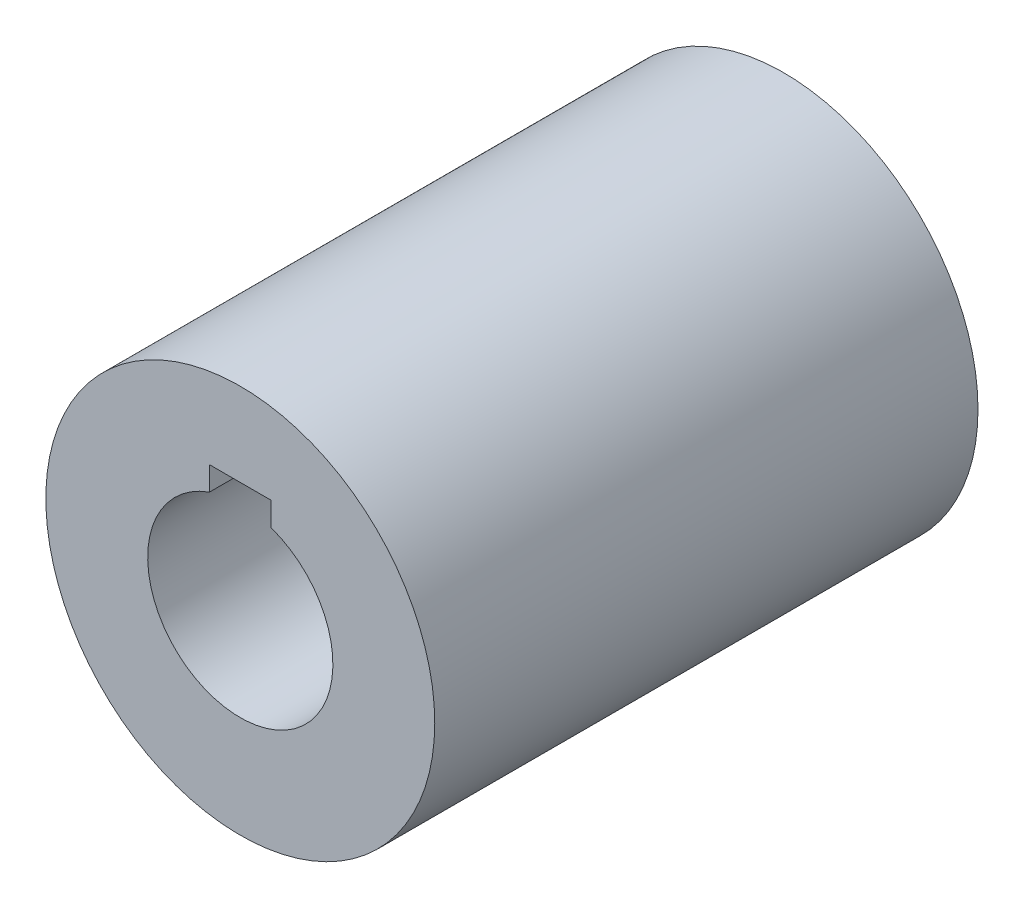
ISO-10303-21;
HEADER;
FILE_DESCRIPTION(('STEP AP214'),'2;1');
FILE_NAME('part.step','',(''),(''),'','','');
FILE_SCHEMA(('AUTOMOTIVE_DESIGN { 1 0 10303 214 1 1 1 1 }'));
ENDSEC;
DATA;
#1=APPLICATION_CONTEXT('core data for automotive mechanical design processes');
#2=APPLICATION_PROTOCOL_DEFINITION('international standard','automotive_design',2000,#1);
#3=PRODUCT_CONTEXT('',#1,'mechanical');
#4=PRODUCT('Part','Part','',(#3));
#5=PRODUCT_RELATED_PRODUCT_CATEGORY('part','',(#4));
#6=PRODUCT_DEFINITION_FORMATION('','',#4);
#7=PRODUCT_DEFINITION_CONTEXT('part definition',#1,'design');
#8=PRODUCT_DEFINITION('design','',#6,#7);
#9=PRODUCT_DEFINITION_SHAPE('','',#8);
#10=(LENGTH_UNIT() NAMED_UNIT(*) SI_UNIT(.MILLI.,.METRE.));
#11=(NAMED_UNIT(*) PLANE_ANGLE_UNIT() SI_UNIT($,.RADIAN.));
#12=(NAMED_UNIT(*) SI_UNIT($,.STERADIAN.) SOLID_ANGLE_UNIT());
#13=UNCERTAINTY_MEASURE_WITH_UNIT(LENGTH_MEASURE(1.E-05),#10,'distance_accuracy_value','');
#14=(GEOMETRIC_REPRESENTATION_CONTEXT(3) GLOBAL_UNCERTAINTY_ASSIGNED_CONTEXT((#13)) GLOBAL_UNIT_ASSIGNED_CONTEXT((#10,
#11,#12)) REPRESENTATION_CONTEXT('',''));
#15=CARTESIAN_POINT('',(0.,0.,0.));
#16=DIRECTION('',(0.,0.,1.));
#17=DIRECTION('',(1.,0.,0.));
#18=AXIS2_PLACEMENT_3D('',#15,#16,#17);
#19=CARTESIAN_POINT('',(0.,0.,88.));
#20=DIRECTION('',(0.,0.,1.));
#21=DIRECTION('',(1.,0.,0.));
#22=AXIS2_PLACEMENT_3D('',#19,#20,#21);
#23=PLANE('',#22);
#24=CARTESIAN_POINT('',(0.,0.,88.));
#25=DIRECTION('',(0.,0.,1.));
#26=DIRECTION('',(1.,0.,0.));
#27=AXIS2_PLACEMENT_3D('',#24,#25,#26);
#28=CIRCLE('',#27,31.5);
#29=CARTESIAN_POINT('',(31.5,0.,88.));
#30=VERTEX_POINT('',#29);
#31=EDGE_CURVE('E11',#30,#30,#28,.T.);
#32=ORIENTED_EDGE('',*,*,#31,.T.);
#33=EDGE_LOOP('',(#32));
#34=FACE_BOUND('',#33,.T.);
#35=DIRECTION('',(0.,1.,0.));
#36=VECTOR('',#35,1.);
#37=CARTESIAN_POINT('',(5.,18.,88.));
#38=LINE('',#37,#36);
#39=CARTESIAN_POINT('',(4.99999999999999,14.142135623731,88.));
#40=VERTEX_POINT('',#39);
#41=CARTESIAN_POINT('',(5.,18.,88.));
#42=VERTEX_POINT('',#41);
#43=EDGE_CURVE('E90',#40,#42,#38,.T.);
#44=ORIENTED_EDGE('',*,*,#43,.F.);
#45=CARTESIAN_POINT('',(0.,0.,88.));
#46=DIRECTION('',(0.,0.,1.));
#47=DIRECTION('',(1.,0.,0.));
#48=AXIS2_PLACEMENT_3D('',#45,#46,#47);
#49=CIRCLE('',#48,15.);
#50=CARTESIAN_POINT('',(-5.,14.142135623731,88.));
#51=VERTEX_POINT('',#50);
#52=EDGE_CURVE('E82',#51,#40,#49,.T.);
#53=ORIENTED_EDGE('',*,*,#52,.F.);
#54=DIRECTION('',(0.,-1.,0.));
#55=VECTOR('',#54,1.);
#56=CARTESIAN_POINT('',(-5.,18.,88.));
#57=LINE('',#56,#55);
#58=CARTESIAN_POINT('',(-5.,18.,88.));
#59=VERTEX_POINT('',#58);
#60=EDGE_CURVE('E103',#59,#51,#57,.T.);
#61=ORIENTED_EDGE('',*,*,#60,.F.);
#62=DIRECTION('',(-1.,0.,0.));
#63=VECTOR('',#62,1.);
#64=CARTESIAN_POINT('',(-5.,18.,88.));
#65=LINE('',#64,#63);
#66=EDGE_CURVE('E101',#42,#59,#65,.T.);
#67=ORIENTED_EDGE('',*,*,#66,.F.);
#68=EDGE_LOOP('',(#44,#53,#61,#67));
#69=FACE_BOUND('',#68,.T.);
#70=ADVANCED_FACE('F41',(#34,#69),#23,.T.);
#71=CARTESIAN_POINT('',(0.,0.,0.));
#72=DIRECTION('',(0.,0.,1.));
#73=DIRECTION('',(1.,0.,0.));
#74=AXIS2_PLACEMENT_3D('',#71,#72,#73);
#75=PLANE('',#74);
#76=CARTESIAN_POINT('',(0.,0.,0.));
#77=DIRECTION('',(0.,0.,1.));
#78=DIRECTION('',(1.,0.,0.));
#79=AXIS2_PLACEMENT_3D('',#76,#77,#78);
#80=CIRCLE('',#79,31.5);
#81=CARTESIAN_POINT('',(31.5,0.,0.));
#82=VERTEX_POINT('',#81);
#83=EDGE_CURVE('E45',#82,#82,#80,.T.);
#84=ORIENTED_EDGE('',*,*,#83,.F.);
#85=EDGE_LOOP('',(#84));
#86=FACE_BOUND('',#85,.T.);
#87=CARTESIAN_POINT('',(0.,0.,0.));
#88=DIRECTION('',(0.,0.,1.));
#89=DIRECTION('',(1.,0.,0.));
#90=AXIS2_PLACEMENT_3D('',#87,#88,#89);
#91=CIRCLE('',#90,15.);
#92=CARTESIAN_POINT('',(-5.,14.142135623731,0.));
#93=VERTEX_POINT('',#92);
#94=CARTESIAN_POINT('',(4.99999999999999,14.142135623731,0.));
#95=VERTEX_POINT('',#94);
#96=EDGE_CURVE('E64',#93,#95,#91,.T.);
#97=ORIENTED_EDGE('',*,*,#96,.T.);
#98=DIRECTION('',(0.,1.,0.));
#99=VECTOR('',#98,1.);
#100=CARTESIAN_POINT('',(5.,18.,0.));
#101=LINE('',#100,#99);
#102=CARTESIAN_POINT('',(5.,18.,0.));
#103=VERTEX_POINT('',#102);
#104=EDGE_CURVE('E97',#95,#103,#101,.T.);
#105=ORIENTED_EDGE('',*,*,#104,.T.);
#106=DIRECTION('',(-1.,0.,0.));
#107=VECTOR('',#106,1.);
#108=CARTESIAN_POINT('',(-5.,18.,0.));
#109=LINE('',#108,#107);
#110=CARTESIAN_POINT('',(-5.,18.,0.));
#111=VERTEX_POINT('',#110);
#112=EDGE_CURVE('E109',#103,#111,#109,.T.);
#113=ORIENTED_EDGE('',*,*,#112,.T.);
#114=DIRECTION('',(0.,-1.,0.));
#115=VECTOR('',#114,1.);
#116=CARTESIAN_POINT('',(-5.,18.,0.));
#117=LINE('',#116,#115);
#118=EDGE_CURVE('E91',#111,#93,#117,.T.);
#119=ORIENTED_EDGE('',*,*,#118,.T.);
#120=EDGE_LOOP('',(#97,#105,#113,#119));
#121=FACE_BOUND('',#120,.T.);
#122=ADVANCED_FACE('F120',(#86,#121),#75,.F.);
#123=CARTESIAN_POINT('',(0.,0.,88.));
#124=DIRECTION('',(0.,0.,-1.));
#125=DIRECTION('',(-1.,0.,0.));
#126=AXIS2_PLACEMENT_3D('',#123,#124,#125);
#127=CYLINDRICAL_SURFACE('',#126,31.5);
#128=ORIENTED_EDGE('',*,*,#31,.F.);
#129=EDGE_LOOP('',(#128));
#130=FACE_BOUND('',#129,.T.);
#131=ORIENTED_EDGE('',*,*,#83,.T.);
#132=EDGE_LOOP('',(#131));
#133=FACE_BOUND('',#132,.T.);
#134=ADVANCED_FACE('F43',(#130,#133),#127,.T.);
#135=CARTESIAN_POINT('',(0.,0.,88.));
#136=DIRECTION('',(0.,0.,-1.));
#137=DIRECTION('',(-1.,0.,0.));
#138=AXIS2_PLACEMENT_3D('',#135,#136,#137);
#139=CYLINDRICAL_SURFACE('',#138,15.);
#140=ORIENTED_EDGE('',*,*,#96,.F.);
#141=DIRECTION('',(0.,0.,-1.));
#142=VECTOR('',#141,1.);
#143=CARTESIAN_POINT('',(-5.,14.142135623731,88.));
#144=LINE('',#143,#142);
#145=EDGE_CURVE('E86',#51,#93,#144,.T.);
#146=ORIENTED_EDGE('',*,*,#145,.F.);
#147=ORIENTED_EDGE('',*,*,#52,.T.);
#148=DIRECTION('',(0.,0.,-1.));
#149=VECTOR('',#148,1.);
#150=CARTESIAN_POINT('',(4.99999999999999,14.142135623731,88.));
#151=LINE('',#150,#149);
#152=EDGE_CURVE('E85',#40,#95,#151,.T.);
#153=ORIENTED_EDGE('',*,*,#152,.T.);
#154=EDGE_LOOP('',(#140,#146,#147,#153));
#155=FACE_BOUND('',#154,.T.);
#156=ADVANCED_FACE('F84',(#155),#139,.F.);
#157=CARTESIAN_POINT('',(5.,18.,88.));
#158=DIRECTION('',(-1.,0.,0.));
#159=DIRECTION('',(0.,-1.,0.));
#160=AXIS2_PLACEMENT_3D('',#157,#158,#159);
#161=PLANE('',#160);
#162=ORIENTED_EDGE('',*,*,#104,.F.);
#163=ORIENTED_EDGE('',*,*,#152,.F.);
#164=ORIENTED_EDGE('',*,*,#43,.T.);
#165=DIRECTION('',(0.,0.,-1.));
#166=VECTOR('',#165,1.);
#167=CARTESIAN_POINT('',(5.,18.,88.));
#168=LINE('',#167,#166);
#169=EDGE_CURVE('E98',#42,#103,#168,.T.);
#170=ORIENTED_EDGE('',*,*,#169,.T.);
#171=EDGE_LOOP('',(#162,#163,#164,#170));
#172=FACE_BOUND('',#171,.T.);
#173=ADVANCED_FACE('F94',(#172),#161,.T.);
#174=CARTESIAN_POINT('',(-5.,18.,88.));
#175=DIRECTION('',(0.,-1.,0.));
#176=DIRECTION('',(0.,0.,-1.));
#177=AXIS2_PLACEMENT_3D('',#174,#175,#176);
#178=PLANE('',#177);
#179=ORIENTED_EDGE('',*,*,#112,.F.);
#180=ORIENTED_EDGE('',*,*,#169,.F.);
#181=ORIENTED_EDGE('',*,*,#66,.T.);
#182=DIRECTION('',(0.,0.,-1.));
#183=VECTOR('',#182,1.);
#184=CARTESIAN_POINT('',(-5.,18.,88.));
#185=LINE('',#184,#183);
#186=EDGE_CURVE('E56',#59,#111,#185,.T.);
#187=ORIENTED_EDGE('',*,*,#186,.T.);
#188=EDGE_LOOP('',(#179,#180,#181,#187));
#189=FACE_BOUND('',#188,.T.);
#190=ADVANCED_FACE('F118',(#189),#178,.T.);
#191=CARTESIAN_POINT('',(-5.,18.,88.));
#192=DIRECTION('',(1.,0.,0.));
#193=DIRECTION('',(0.,1.,0.));
#194=AXIS2_PLACEMENT_3D('',#191,#192,#193);
#195=PLANE('',#194);
#196=ORIENTED_EDGE('',*,*,#118,.F.);
#197=ORIENTED_EDGE('',*,*,#186,.F.);
#198=ORIENTED_EDGE('',*,*,#60,.T.);
#199=ORIENTED_EDGE('',*,*,#145,.T.);
#200=EDGE_LOOP('',(#196,#197,#198,#199));
#201=FACE_BOUND('',#200,.T.);
#202=ADVANCED_FACE('F121',(#201),#195,.T.);
#203=CLOSED_SHELL('',(#70,#122,#134,#156,#173,#190,#202));
#204=MANIFOLD_SOLID_BREP('B2',#203);
#205=ADVANCED_BREP_SHAPE_REPRESENTATION('',(#18,#204),#14);
#206=SHAPE_DEFINITION_REPRESENTATION(#9,#205);
ENDSEC;
END-ISO-10303-21;
